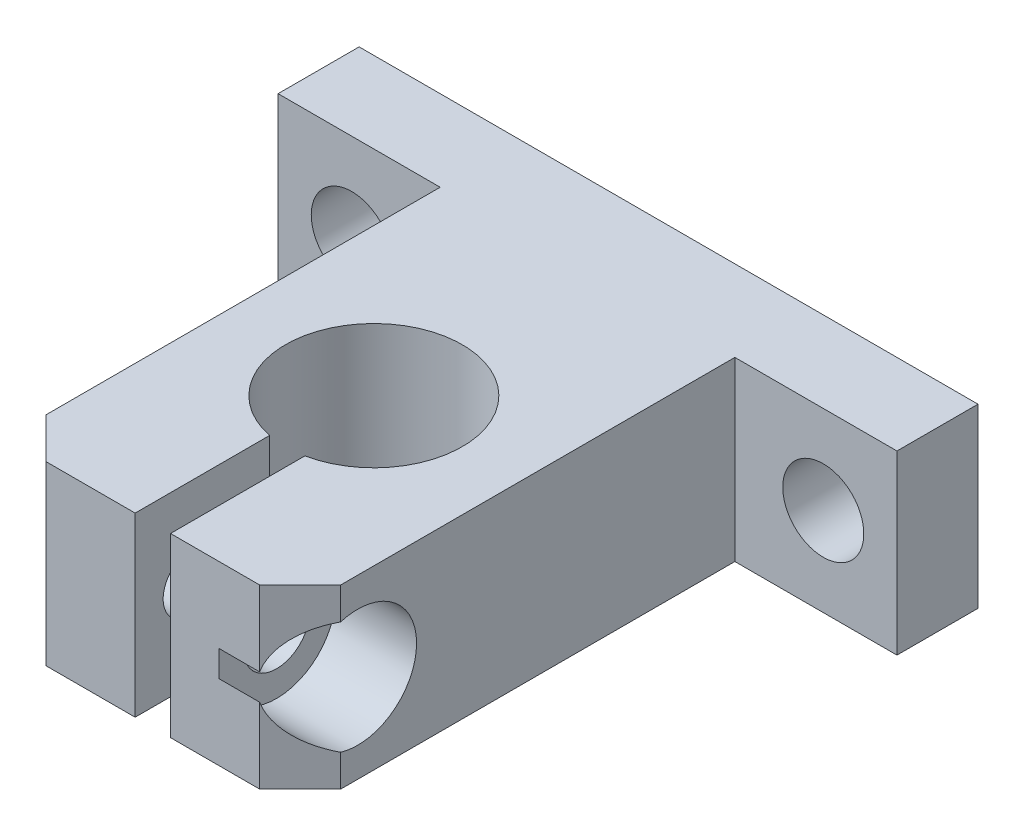
ISO-10303-21;
HEADER;
FILE_DESCRIPTION(('STEP AP214'),'2;1');
FILE_NAME('part.step','',(''),(''),'','','');
FILE_SCHEMA(('AUTOMOTIVE_DESIGN { 1 0 10303 214 1 1 1 1 }'));
ENDSEC;
DATA;
#1=APPLICATION_CONTEXT('core data for automotive mechanical design processes');
#2=APPLICATION_PROTOCOL_DEFINITION('international standard','automotive_design',2000,#1);
#3=PRODUCT_CONTEXT('',#1,'mechanical');
#4=PRODUCT('Part','Part','',(#3));
#5=PRODUCT_RELATED_PRODUCT_CATEGORY('part','',(#4));
#6=PRODUCT_DEFINITION_FORMATION('','',#4);
#7=PRODUCT_DEFINITION_CONTEXT('part definition',#1,'design');
#8=PRODUCT_DEFINITION('design','',#6,#7);
#9=PRODUCT_DEFINITION_SHAPE('','',#8);
#10=(LENGTH_UNIT() NAMED_UNIT(*) SI_UNIT(.MILLI.,.METRE.));
#11=(NAMED_UNIT(*) PLANE_ANGLE_UNIT() SI_UNIT($,.RADIAN.));
#12=(NAMED_UNIT(*) SI_UNIT($,.STERADIAN.) SOLID_ANGLE_UNIT());
#13=UNCERTAINTY_MEASURE_WITH_UNIT(LENGTH_MEASURE(1.E-05),#10,'distance_accuracy_value','');
#14=(GEOMETRIC_REPRESENTATION_CONTEXT(3) GLOBAL_UNCERTAINTY_ASSIGNED_CONTEXT((#13)) GLOBAL_UNIT_ASSIGNED_CONTEXT((#10,
#11,#12)) REPRESENTATION_CONTEXT('',''));
#15=CARTESIAN_POINT('',(0.,0.,0.));
#16=DIRECTION('',(0.,0.,1.));
#17=DIRECTION('',(1.,0.,0.));
#18=AXIS2_PLACEMENT_3D('',#15,#16,#17);
#19=CARTESIAN_POINT('',(8.,0.,11.1));
#20=DIRECTION('',(-1.,0.,0.));
#21=DIRECTION('',(0.,0.,1.));
#22=AXIS2_PLACEMENT_3D('',#19,#20,#21);
#23=CYLINDRICAL_SURFACE('',#22,2.25);
#24=CARTESIAN_POINT('',(4.5,0.,11.1));
#25=DIRECTION('',(-1.,0.,0.));
#26=DIRECTION('',(0.,0.,1.));
#27=AXIS2_PLACEMENT_3D('',#24,#25,#26);
#28=CIRCLE('',#27,2.25);
#29=CARTESIAN_POINT('',(4.5,0.,13.35));
#30=VERTEX_POINT('',#29);
#31=EDGE_CURVE('E18',#30,#30,#28,.F.);
#32=ORIENTED_EDGE('',*,*,#31,.T.);
#33=EDGE_LOOP('',(#32));
#34=FACE_BOUND('',#33,.T.);
#35=CARTESIAN_POINT('',(1.2,0.,11.1));
#36=DIRECTION('',(-1.,0.,0.));
#37=DIRECTION('',(0.,0.,1.));
#38=AXIS2_PLACEMENT_3D('',#35,#36,#37);
#39=CIRCLE('',#38,2.25);
#40=CARTESIAN_POINT('',(1.2,0.,13.35));
#41=VERTEX_POINT('',#40);
#42=EDGE_CURVE('E176',#41,#41,#39,.F.);
#43=ORIENTED_EDGE('',*,*,#42,.F.);
#44=EDGE_LOOP('',(#43));
#45=FACE_BOUND('',#44,.T.);
#46=ADVANCED_FACE('F15',(#34,#45),#23,.F.);
#47=CARTESIAN_POINT('',(-8.,0.,11.1));
#48=DIRECTION('',(1.,0.,0.));
#49=DIRECTION('',(0.,0.,-1.));
#50=AXIS2_PLACEMENT_3D('',#47,#48,#49);
#51=CYLINDRICAL_SURFACE('',#50,2.);
#52=CARTESIAN_POINT('',(-10.,0.,11.1));
#53=DIRECTION('',(1.,0.,0.));
#54=DIRECTION('',(0.,0.,-1.));
#55=AXIS2_PLACEMENT_3D('',#52,#53,#54);
#56=CIRCLE('',#55,2.);
#57=CARTESIAN_POINT('',(-10.,-1.63630681719536,12.25));
#58=VERTEX_POINT('',#57);
#59=CARTESIAN_POINT('',(-10.,1.63630681719536,12.25));
#60=VERTEX_POINT('',#59);
#61=EDGE_CURVE('E303',#58,#60,#56,.T.);
#62=ORIENTED_EDGE('',*,*,#61,.F.);
#63=CARTESIAN_POINT('',(-11.15,0.,11.1));
#64=DIRECTION('',(-0.707106781186548,0.,0.707106781186548));
#65=DIRECTION('',(0.707106781186548,0.,0.707106781186548));
#66=AXIS2_PLACEMENT_3D('',#63,#64,#65);
#67=ELLIPSE('',#66,2.82842712474619,2.);
#68=EDGE_CURVE('E309',#60,#58,#67,.F.);
#69=ORIENTED_EDGE('',*,*,#68,.F.);
#70=EDGE_LOOP('',(#62,#69));
#71=FACE_BOUND('',#70,.T.);
#72=CARTESIAN_POINT('',(-1.2,0.,11.1));
#73=DIRECTION('',(1.,0.,0.));
#74=DIRECTION('',(0.,0.,-1.));
#75=AXIS2_PLACEMENT_3D('',#72,#73,#74);
#76=CIRCLE('',#75,2.);
#77=CARTESIAN_POINT('',(-1.2,0.,9.1));
#78=VERTEX_POINT('',#77);
#79=EDGE_CURVE('E340',#78,#78,#76,.F.);
#80=ORIENTED_EDGE('',*,*,#79,.F.);
#81=EDGE_LOOP('',(#80));
#82=FACE_BOUND('',#81,.T.);
#83=ADVANCED_FACE('F450',(#71,#82),#51,.F.);
#84=CARTESIAN_POINT('',(-16.,0.,-2.5));
#85=DIRECTION('',(0.,0.,-1.));
#86=DIRECTION('',(-1.,0.,0.));
#87=AXIS2_PLACEMENT_3D('',#84,#85,#86);
#88=CYLINDRICAL_SURFACE('',#87,2.75);
#89=CARTESIAN_POINT('',(-16.,0.,-20.));
#90=DIRECTION('',(0.,0.,-1.));
#91=DIRECTION('',(-1.,0.,0.));
#92=AXIS2_PLACEMENT_3D('',#89,#90,#91);
#93=CIRCLE('',#92,2.75);
#94=CARTESIAN_POINT('',(-18.75,0.,-20.));
#95=VERTEX_POINT('',#94);
#96=EDGE_CURVE('E257',#95,#95,#93,.F.);
#97=ORIENTED_EDGE('',*,*,#96,.F.);
#98=EDGE_LOOP('',(#97));
#99=FACE_BOUND('',#98,.T.);
#100=CARTESIAN_POINT('',(-16.,0.,-14.5));
#101=DIRECTION('',(0.,0.,-1.));
#102=DIRECTION('',(-1.,0.,0.));
#103=AXIS2_PLACEMENT_3D('',#100,#101,#102);
#104=CIRCLE('',#103,2.75);
#105=CARTESIAN_POINT('',(-18.75,0.,-14.5));
#106=VERTEX_POINT('',#105);
#107=EDGE_CURVE('E282',#106,#106,#104,.T.);
#108=ORIENTED_EDGE('',*,*,#107,.F.);
#109=EDGE_LOOP('',(#108));
#110=FACE_BOUND('',#109,.T.);
#111=ADVANCED_FACE('F453',(#99,#110),#88,.F.);
#112=CARTESIAN_POINT('',(16.,0.,-2.5));
#113=DIRECTION('',(0.,0.,-1.));
#114=DIRECTION('',(-1.,0.,0.));
#115=AXIS2_PLACEMENT_3D('',#112,#113,#114);
#116=CYLINDRICAL_SURFACE('',#115,2.75);
#117=CARTESIAN_POINT('',(16.,0.,-20.));
#118=DIRECTION('',(0.,0.,-1.));
#119=DIRECTION('',(-1.,0.,0.));
#120=AXIS2_PLACEMENT_3D('',#117,#118,#119);
#121=CIRCLE('',#120,2.75);
#122=CARTESIAN_POINT('',(13.25,0.,-20.));
#123=VERTEX_POINT('',#122);
#124=EDGE_CURVE('E252',#123,#123,#121,.F.);
#125=ORIENTED_EDGE('',*,*,#124,.F.);
#126=EDGE_LOOP('',(#125));
#127=FACE_BOUND('',#126,.T.);
#128=CARTESIAN_POINT('',(16.,0.,-14.5));
#129=DIRECTION('',(0.,0.,-1.));
#130=DIRECTION('',(-1.,0.,0.));
#131=AXIS2_PLACEMENT_3D('',#128,#129,#130);
#132=CIRCLE('',#131,2.75);
#133=CARTESIAN_POINT('',(13.25,0.,-14.5));
#134=VERTEX_POINT('',#133);
#135=EDGE_CURVE('E223',#134,#134,#132,.T.);
#136=ORIENTED_EDGE('',*,*,#135,.F.);
#137=EDGE_LOOP('',(#136));
#138=FACE_BOUND('',#137,.T.);
#139=ADVANCED_FACE('F640',(#127,#138),#116,.F.);
#140=CARTESIAN_POINT('',(4.5,0.,11.1));
#141=DIRECTION('',(-1.,0.,0.));
#142=DIRECTION('',(0.,0.,1.));
#143=AXIS2_PLACEMENT_3D('',#140,#141,#142);
#144=PLANE('',#143);
#145=DIRECTION('',(0.,1.,0.));
#146=VECTOR('',#145,1.);
#147=CARTESIAN_POINT('',(4.5,6.,15.));
#148=LINE('',#147,#146);
#149=CARTESIAN_POINT('',(4.5,-0.888819441731564,15.));
#150=VERTEX_POINT('',#149);
#151=CARTESIAN_POINT('',(4.5,0.888819441731564,15.));
#152=VERTEX_POINT('',#151);
#153=EDGE_CURVE('E148',#150,#152,#148,.T.);
#154=ORIENTED_EDGE('',*,*,#153,.F.);
#155=CARTESIAN_POINT('',(4.5,0.,11.1));
#156=DIRECTION('',(-1.,0.,0.));
#157=DIRECTION('',(0.,0.,1.));
#158=AXIS2_PLACEMENT_3D('',#155,#156,#157);
#159=CIRCLE('',#158,4.);
#160=EDGE_CURVE('E138',#150,#152,#159,.F.);
#161=ORIENTED_EDGE('',*,*,#160,.T.);
#162=EDGE_LOOP('',(#154,#161));
#163=FACE_BOUND('',#162,.T.);
#164=ORIENTED_EDGE('',*,*,#31,.F.);
#165=EDGE_LOOP('',(#164));
#166=FACE_BOUND('',#165,.T.);
#167=ADVANCED_FACE('F149',(#163,#166),#144,.F.);
#168=CARTESIAN_POINT('',(10.,0.,11.1));
#169=DIRECTION('',(-1.,0.,0.));
#170=DIRECTION('',(0.,0.,1.));
#171=AXIS2_PLACEMENT_3D('',#168,#169,#170);
#172=CYLINDRICAL_SURFACE('',#171,4.);
#173=CARTESIAN_POINT('',(10.,0.,11.1));
#174=DIRECTION('',(-1.,0.,0.));
#175=DIRECTION('',(0.,0.,1.));
#176=AXIS2_PLACEMENT_3D('',#173,#174,#175);
#177=CIRCLE('',#176,4.);
#178=CARTESIAN_POINT('',(10.,3.8311225508981,12.25));
#179=VERTEX_POINT('',#178);
#180=CARTESIAN_POINT('',(10.,-3.83112255089811,12.25));
#181=VERTEX_POINT('',#180);
#182=EDGE_CURVE('E208',#179,#181,#177,.T.);
#183=ORIENTED_EDGE('',*,*,#182,.F.);
#184=CARTESIAN_POINT('',(11.15,0.,11.1));
#185=DIRECTION('',(0.707106781186548,0.,0.707106781186548));
#186=DIRECTION('',(-0.707106781186548,0.,0.707106781186548));
#187=AXIS2_PLACEMENT_3D('',#184,#185,#186);
#188=ELLIPSE('',#187,5.65685424949238,4.);
#189=CARTESIAN_POINT('',(7.25,0.888819441731565,15.));
#190=VERTEX_POINT('',#189);
#191=EDGE_CURVE('E147',#190,#179,#188,.F.);
#192=ORIENTED_EDGE('',*,*,#191,.F.);
#193=DIRECTION('',(1.,0.,0.));
#194=VECTOR('',#193,1.);
#195=CARTESIAN_POINT('',(0.,0.888819441731565,15.));
#196=LINE('',#195,#194);
#197=EDGE_CURVE('E145',#152,#190,#196,.T.);
#198=ORIENTED_EDGE('',*,*,#197,.F.);
#199=ORIENTED_EDGE('',*,*,#160,.F.);
#200=DIRECTION('',(1.,0.,0.));
#201=VECTOR('',#200,1.);
#202=CARTESIAN_POINT('',(0.,-0.888819441731565,15.));
#203=LINE('',#202,#201);
#204=CARTESIAN_POINT('',(7.25,-0.888819441731564,15.));
#205=VERTEX_POINT('',#204);
#206=EDGE_CURVE('E143',#205,#150,#203,.F.);
#207=ORIENTED_EDGE('',*,*,#206,.F.);
#208=CARTESIAN_POINT('',(11.15,0.,11.1));
#209=DIRECTION('',(0.707106781186548,0.,0.707106781186548));
#210=DIRECTION('',(-0.707106781186548,0.,0.707106781186548));
#211=AXIS2_PLACEMENT_3D('',#208,#209,#210);
#212=ELLIPSE('',#211,5.65685424949238,4.);
#213=EDGE_CURVE('E157',#181,#205,#212,.F.);
#214=ORIENTED_EDGE('',*,*,#213,.F.);
#215=EDGE_LOOP('',(#183,#192,#198,#199,#207,#214));
#216=FACE_BOUND('',#215,.T.);
#217=ADVANCED_FACE('F141',(#216),#172,.F.);
#218=CARTESIAN_POINT('',(7.25,6.,15.));
#219=DIRECTION('',(0.707106781186548,0.,0.707106781186548));
#220=DIRECTION('',(0.707106781186548,0.,-0.707106781186548));
#221=AXIS2_PLACEMENT_3D('',#218,#219,#220);
#222=PLANE('',#221);
#223=DIRECTION('',(-0.707106781186548,0.,0.707106781186547));
#224=VECTOR('',#223,1.);
#225=CARTESIAN_POINT('',(10.,6.,12.25));
#226=LINE('',#225,#224);
#227=CARTESIAN_POINT('',(10.,6.,12.25));
#228=VERTEX_POINT('',#227);
#229=CARTESIAN_POINT('',(7.25,6.,15.));
#230=VERTEX_POINT('',#229);
#231=EDGE_CURVE('E185',#228,#230,#226,.T.);
#232=ORIENTED_EDGE('',*,*,#231,.T.);
#233=DIRECTION('',(0.,1.,0.));
#234=VECTOR('',#233,1.);
#235=CARTESIAN_POINT('',(7.25,6.,15.));
#236=LINE('',#235,#234);
#237=EDGE_CURVE('E182',#190,#230,#236,.T.);
#238=ORIENTED_EDGE('',*,*,#237,.F.);
#239=ORIENTED_EDGE('',*,*,#191,.T.);
#240=DIRECTION('',(0.,1.,0.));
#241=VECTOR('',#240,1.);
#242=CARTESIAN_POINT('',(10.,0.,12.25));
#243=LINE('',#242,#241);
#244=EDGE_CURVE('E202',#228,#179,#243,.F.);
#245=ORIENTED_EDGE('',*,*,#244,.F.);
#246=EDGE_LOOP('',(#232,#238,#239,#245));
#247=FACE_BOUND('',#246,.T.);
#248=ADVANCED_FACE('F352',(#247),#222,.T.);
#249=CARTESIAN_POINT('',(0.,6.,-5.11236996327425));
#250=DIRECTION('',(0.,-1.,0.));
#251=DIRECTION('',(0.,0.,-1.));
#252=AXIS2_PLACEMENT_3D('',#249,#250,#251);
#253=PLANE('',#252);
#254=DIRECTION('',(1.,0.,0.));
#255=VECTOR('',#254,1.);
#256=CARTESIAN_POINT('',(0.,6.,15.));
#257=LINE('',#256,#255);
#258=CARTESIAN_POINT('',(1.2,6.,15.));
#259=VERTEX_POINT('',#258);
#260=EDGE_CURVE('E179',#230,#259,#257,.F.);
#261=ORIENTED_EDGE('',*,*,#260,.F.);
#262=ORIENTED_EDGE('',*,*,#231,.F.);
#263=DIRECTION('',(0.,0.,-1.));
#264=VECTOR('',#263,1.);
#265=CARTESIAN_POINT('',(10.,6.,3.));
#266=LINE('',#265,#264);
#267=CARTESIAN_POINT('',(10.,6.,-14.5));
#268=VERTEX_POINT('',#267);
#269=EDGE_CURVE('E199',#268,#228,#266,.F.);
#270=ORIENTED_EDGE('',*,*,#269,.F.);
#271=DIRECTION('',(1.,0.,0.));
#272=VECTOR('',#271,1.);
#273=CARTESIAN_POINT('',(20.,6.,-14.5));
#274=LINE('',#273,#272);
#275=CARTESIAN_POINT('',(21.,6.,-14.5));
#276=VERTEX_POINT('',#275);
#277=EDGE_CURVE('E211',#276,#268,#274,.F.);
#278=ORIENTED_EDGE('',*,*,#277,.F.);
#279=DIRECTION('',(0.,0.,-1.));
#280=VECTOR('',#279,1.);
#281=CARTESIAN_POINT('',(21.,6.,1.25));
#282=LINE('',#281,#280);
#283=CARTESIAN_POINT('',(21.,6.,-20.));
#284=VERTEX_POINT('',#283);
#285=EDGE_CURVE('E226',#284,#276,#282,.F.);
#286=ORIENTED_EDGE('',*,*,#285,.F.);
#287=DIRECTION('',(-1.,0.,0.));
#288=VECTOR('',#287,1.);
#289=CARTESIAN_POINT('',(21.,6.,-20.));
#290=LINE('',#289,#288);
#291=CARTESIAN_POINT('',(-21.,6.,-20.));
#292=VERTEX_POINT('',#291);
#293=EDGE_CURVE('E238',#292,#284,#290,.F.);
#294=ORIENTED_EDGE('',*,*,#293,.F.);
#295=DIRECTION('',(0.,0.,1.));
#296=VECTOR('',#295,1.);
#297=CARTESIAN_POINT('',(-21.,6.,-20.));
#298=LINE('',#297,#296);
#299=CARTESIAN_POINT('',(-21.,6.,-14.5));
#300=VERTEX_POINT('',#299);
#301=EDGE_CURVE('E255',#300,#292,#298,.F.);
#302=ORIENTED_EDGE('',*,*,#301,.F.);
#303=DIRECTION('',(1.,0.,0.));
#304=VECTOR('',#303,1.);
#305=CARTESIAN_POINT('',(-20.,6.,-14.5));
#306=LINE('',#305,#304);
#307=CARTESIAN_POINT('',(-10.,6.,-14.5));
#308=VERTEX_POINT('',#307);
#309=EDGE_CURVE('E268',#308,#300,#306,.F.);
#310=ORIENTED_EDGE('',*,*,#309,.F.);
#311=DIRECTION('',(0.,0.,1.));
#312=VECTOR('',#311,1.);
#313=CARTESIAN_POINT('',(-10.,6.,3.));
#314=LINE('',#313,#312);
#315=CARTESIAN_POINT('',(-10.,6.,12.25));
#316=VERTEX_POINT('',#315);
#317=EDGE_CURVE('E285',#316,#308,#314,.F.);
#318=ORIENTED_EDGE('',*,*,#317,.F.);
#319=DIRECTION('',(0.707106781186548,0.,0.707106781186548));
#320=VECTOR('',#319,1.);
#321=CARTESIAN_POINT('',(-21.,6.,1.25));
#322=LINE('',#321,#320);
#323=CARTESIAN_POINT('',(-7.25,6.,15.));
#324=VERTEX_POINT('',#323);
#325=EDGE_CURVE('E301',#324,#316,#322,.F.);
#326=ORIENTED_EDGE('',*,*,#325,.F.);
#327=DIRECTION('',(1.,0.,0.));
#328=VECTOR('',#327,1.);
#329=CARTESIAN_POINT('',(0.,6.,15.));
#330=LINE('',#329,#328);
#331=CARTESIAN_POINT('',(-1.2,6.,15.));
#332=VERTEX_POINT('',#331);
#333=EDGE_CURVE('E312',#332,#324,#330,.F.);
#334=ORIENTED_EDGE('',*,*,#333,.F.);
#335=DIRECTION('',(0.,0.,-1.));
#336=VECTOR('',#335,1.);
#337=CARTESIAN_POINT('',(-1.2,6.,17.5));
#338=LINE('',#337,#336);
#339=CARTESIAN_POINT('',(-1.2,6.,5.87877538267963));
#340=VERTEX_POINT('',#339);
#341=EDGE_CURVE('E317',#340,#332,#338,.F.);
#342=ORIENTED_EDGE('',*,*,#341,.F.);
#343=CARTESIAN_POINT('',(0.,6.,0.));
#344=DIRECTION('',(0.,1.,0.));
#345=DIRECTION('',(0.,0.,1.));
#346=AXIS2_PLACEMENT_3D('',#343,#344,#345);
#347=CIRCLE('',#346,6.);
#348=CARTESIAN_POINT('',(1.2,6.,5.87877538267963));
#349=VERTEX_POINT('',#348);
#350=EDGE_CURVE('E343',#340,#349,#347,.F.);
#351=ORIENTED_EDGE('',*,*,#350,.T.);
#352=DIRECTION('',(0.,0.,1.));
#353=VECTOR('',#352,1.);
#354=CARTESIAN_POINT('',(1.2,6.,17.5));
#355=LINE('',#354,#353);
#356=EDGE_CURVE('E172',#259,#349,#355,.F.);
#357=ORIENTED_EDGE('',*,*,#356,.F.);
#358=EDGE_LOOP('',(#261,#262,#270,#278,#286,#294,#302,#310,#318,#326,#334,#342,#351,#357));
#359=FACE_BOUND('',#358,.T.);
#360=ADVANCED_FACE('F400',(#359),#253,.F.);
#361=CARTESIAN_POINT('',(1.2,0.,17.5));
#362=DIRECTION('',(-1.,0.,0.));
#363=DIRECTION('',(0.,0.,1.));
#364=AXIS2_PLACEMENT_3D('',#361,#362,#363);
#365=PLANE('',#364);
#366=DIRECTION('',(0.,1.,0.));
#367=VECTOR('',#366,1.);
#368=CARTESIAN_POINT('',(1.2,6.,15.));
#369=LINE('',#368,#367);
#370=CARTESIAN_POINT('',(1.2,-6.,15.));
#371=VERTEX_POINT('',#370);
#372=EDGE_CURVE('E164',#259,#371,#369,.F.);
#373=ORIENTED_EDGE('',*,*,#372,.F.);
#374=ORIENTED_EDGE('',*,*,#356,.T.);
#375=DIRECTION('',(0.,1.,0.));
#376=VECTOR('',#375,1.);
#377=CARTESIAN_POINT('',(1.2,0.,5.87877538267963));
#378=LINE('',#377,#376);
#379=CARTESIAN_POINT('',(1.2,-6.,5.87877538267963));
#380=VERTEX_POINT('',#379);
#381=EDGE_CURVE('E175',#349,#380,#378,.F.);
#382=ORIENTED_EDGE('',*,*,#381,.T.);
#383=DIRECTION('',(0.,0.,-1.));
#384=VECTOR('',#383,1.);
#385=CARTESIAN_POINT('',(1.2,-6.,-5.11236996327425));
#386=LINE('',#385,#384);
#387=EDGE_CURVE('E163',#371,#380,#386,.T.);
#388=ORIENTED_EDGE('',*,*,#387,.F.);
#389=EDGE_LOOP('',(#373,#374,#382,#388));
#390=FACE_BOUND('',#389,.T.);
#391=ORIENTED_EDGE('',*,*,#42,.T.);
#392=EDGE_LOOP('',(#391));
#393=FACE_BOUND('',#392,.T.);
#394=ADVANCED_FACE('F403',(#390,#393),#365,.T.);
#395=CARTESIAN_POINT('',(0.,0.,0.));
#396=DIRECTION('',(0.,1.,0.));
#397=DIRECTION('',(0.,0.,1.));
#398=AXIS2_PLACEMENT_3D('',#395,#396,#397);
#399=CYLINDRICAL_SURFACE('',#398,6.);
#400=ORIENTED_EDGE('',*,*,#350,.F.);
#401=DIRECTION('',(0.,1.,0.));
#402=VECTOR('',#401,1.);
#403=CARTESIAN_POINT('',(-1.2,0.,5.87877538267963));
#404=LINE('',#403,#402);
#405=CARTESIAN_POINT('',(-1.2,-6.,5.87877538267963));
#406=VERTEX_POINT('',#405);
#407=EDGE_CURVE('E319',#406,#340,#404,.T.);
#408=ORIENTED_EDGE('',*,*,#407,.F.);
#409=CARTESIAN_POINT('',(0.,-6.,0.));
#410=DIRECTION('',(0.,1.,0.));
#411=DIRECTION('',(0.,0.,1.));
#412=AXIS2_PLACEMENT_3D('',#409,#410,#411);
#413=CIRCLE('',#412,6.);
#414=EDGE_CURVE('E322',#380,#406,#413,.T.);
#415=ORIENTED_EDGE('',*,*,#414,.F.);
#416=ORIENTED_EDGE('',*,*,#381,.F.);
#417=EDGE_LOOP('',(#400,#408,#415,#416));
#418=FACE_BOUND('',#417,.T.);
#419=ADVANCED_FACE('F407',(#418),#399,.F.);
#420=CARTESIAN_POINT('',(-1.2,0.,17.5));
#421=DIRECTION('',(1.,0.,0.));
#422=DIRECTION('',(0.,0.,-1.));
#423=AXIS2_PLACEMENT_3D('',#420,#421,#422);
#424=PLANE('',#423);
#425=DIRECTION('',(0.,1.,0.));
#426=VECTOR('',#425,1.);
#427=CARTESIAN_POINT('',(-1.2,6.,15.));
#428=LINE('',#427,#426);
#429=CARTESIAN_POINT('',(-1.2,-6.,15.));
#430=VERTEX_POINT('',#429);
#431=EDGE_CURVE('E314',#430,#332,#428,.T.);
#432=ORIENTED_EDGE('',*,*,#431,.F.);
#433=DIRECTION('',(0.,0.,-1.));
#434=VECTOR('',#433,1.);
#435=CARTESIAN_POINT('',(-1.2,-6.,-5.11236996327425));
#436=LINE('',#435,#434);
#437=EDGE_CURVE('E324',#406,#430,#436,.F.);
#438=ORIENTED_EDGE('',*,*,#437,.F.);
#439=ORIENTED_EDGE('',*,*,#407,.T.);
#440=ORIENTED_EDGE('',*,*,#341,.T.);
#441=EDGE_LOOP('',(#432,#438,#439,#440));
#442=FACE_BOUND('',#441,.T.);
#443=ORIENTED_EDGE('',*,*,#79,.T.);
#444=EDGE_LOOP('',(#443));
#445=FACE_BOUND('',#444,.T.);
#446=ADVANCED_FACE('F419',(#442,#445),#424,.T.);
#447=CARTESIAN_POINT('',(0.,6.,15.));
#448=DIRECTION('',(0.,0.,1.));
#449=DIRECTION('',(1.,0.,0.));
#450=AXIS2_PLACEMENT_3D('',#447,#448,#449);
#451=PLANE('',#450);
#452=DIRECTION('',(0.,1.,0.));
#453=VECTOR('',#452,1.);
#454=CARTESIAN_POINT('',(-7.25,6.,15.));
#455=LINE('',#454,#453);
#456=CARTESIAN_POINT('',(-7.25,-6.,15.));
#457=VERTEX_POINT('',#456);
#458=EDGE_CURVE('E304',#457,#324,#455,.T.);
#459=ORIENTED_EDGE('',*,*,#458,.F.);
#460=DIRECTION('',(1.,0.,0.));
#461=VECTOR('',#460,1.);
#462=CARTESIAN_POINT('',(0.,-6.,15.));
#463=LINE('',#462,#461);
#464=EDGE_CURVE('E298',#430,#457,#463,.F.);
#465=ORIENTED_EDGE('',*,*,#464,.F.);
#466=ORIENTED_EDGE('',*,*,#431,.T.);
#467=ORIENTED_EDGE('',*,*,#333,.T.);
#468=EDGE_LOOP('',(#459,#465,#466,#467));
#469=FACE_BOUND('',#468,.T.);
#470=ADVANCED_FACE('F423',(#469),#451,.T.);
#471=CARTESIAN_POINT('',(-21.,6.,1.25));
#472=DIRECTION('',(-0.707106781186548,0.,0.707106781186548));
#473=DIRECTION('',(0.707106781186548,0.,0.707106781186548));
#474=AXIS2_PLACEMENT_3D('',#471,#472,#473);
#475=PLANE('',#474);
#476=ORIENTED_EDGE('',*,*,#325,.T.);
#477=DIRECTION('',(0.,1.,0.));
#478=VECTOR('',#477,1.);
#479=CARTESIAN_POINT('',(-10.,0.,12.25));
#480=LINE('',#479,#478);
#481=EDGE_CURVE('E288',#60,#316,#480,.T.);
#482=ORIENTED_EDGE('',*,*,#481,.F.);
#483=ORIENTED_EDGE('',*,*,#68,.T.);
#484=DIRECTION('',(0.,1.,0.));
#485=VECTOR('',#484,1.);
#486=CARTESIAN_POINT('',(-10.,0.,12.25));
#487=LINE('',#486,#485);
#488=CARTESIAN_POINT('',(-10.,-6.,12.25));
#489=VERTEX_POINT('',#488);
#490=EDGE_CURVE('E287',#489,#58,#487,.T.);
#491=ORIENTED_EDGE('',*,*,#490,.F.);
#492=DIRECTION('',(-0.707106781186548,0.,-0.707106781186547));
#493=VECTOR('',#492,1.);
#494=CARTESIAN_POINT('',(-7.25,-6.,15.));
#495=LINE('',#494,#493);
#496=EDGE_CURVE('E293',#457,#489,#495,.T.);
#497=ORIENTED_EDGE('',*,*,#496,.F.);
#498=ORIENTED_EDGE('',*,*,#458,.T.);
#499=EDGE_LOOP('',(#476,#482,#483,#491,#497,#498));
#500=FACE_BOUND('',#499,.T.);
#501=ADVANCED_FACE('F427',(#500),#475,.T.);
#502=CARTESIAN_POINT('',(-10.,0.,3.));
#503=DIRECTION('',(-1.,0.,0.));
#504=DIRECTION('',(0.,0.,1.));
#505=AXIS2_PLACEMENT_3D('',#502,#503,#504);
#506=PLANE('',#505);
#507=DIRECTION('',(0.,0.,-1.));
#508=VECTOR('',#507,1.);
#509=CARTESIAN_POINT('',(-10.,-6.,-5.11236996327425));
#510=LINE('',#509,#508);
#511=CARTESIAN_POINT('',(-10.,-6.,-14.5));
#512=VERTEX_POINT('',#511);
#513=EDGE_CURVE('E277',#489,#512,#510,.T.);
#514=ORIENTED_EDGE('',*,*,#513,.F.);
#515=ORIENTED_EDGE('',*,*,#490,.T.);
#516=ORIENTED_EDGE('',*,*,#61,.T.);
#517=ORIENTED_EDGE('',*,*,#481,.T.);
#518=ORIENTED_EDGE('',*,*,#317,.T.);
#519=DIRECTION('',(0.,1.,0.));
#520=VECTOR('',#519,1.);
#521=CARTESIAN_POINT('',(-10.,0.,-14.5));
#522=LINE('',#521,#520);
#523=EDGE_CURVE('E272',#512,#308,#522,.T.);
#524=ORIENTED_EDGE('',*,*,#523,.F.);
#525=EDGE_LOOP('',(#514,#515,#516,#517,#518,#524));
#526=FACE_BOUND('',#525,.T.);
#527=ADVANCED_FACE('F431',(#526),#506,.T.);
#528=CARTESIAN_POINT('',(-20.,0.,-14.5));
#529=DIRECTION('',(0.,0.,1.));
#530=DIRECTION('',(1.,0.,0.));
#531=AXIS2_PLACEMENT_3D('',#528,#529,#530);
#532=PLANE('',#531);
#533=ORIENTED_EDGE('',*,*,#523,.T.);
#534=ORIENTED_EDGE('',*,*,#309,.T.);
#535=DIRECTION('',(0.,1.,0.));
#536=VECTOR('',#535,1.);
#537=CARTESIAN_POINT('',(-21.,6.,-14.5));
#538=LINE('',#537,#536);
#539=CARTESIAN_POINT('',(-21.,-6.,-14.5));
#540=VERTEX_POINT('',#539);
#541=EDGE_CURVE('E258',#540,#300,#538,.T.);
#542=ORIENTED_EDGE('',*,*,#541,.F.);
#543=DIRECTION('',(1.,0.,0.));
#544=VECTOR('',#543,1.);
#545=CARTESIAN_POINT('',(0.,-6.,-14.5));
#546=LINE('',#545,#544);
#547=EDGE_CURVE('E263',#512,#540,#546,.F.);
#548=ORIENTED_EDGE('',*,*,#547,.F.);
#549=EDGE_LOOP('',(#533,#534,#542,#548));
#550=FACE_BOUND('',#549,.T.);
#551=ORIENTED_EDGE('',*,*,#107,.T.);
#552=EDGE_LOOP('',(#551));
#553=FACE_BOUND('',#552,.T.);
#554=ADVANCED_FACE('F435',(#550,#553),#532,.T.);
#555=CARTESIAN_POINT('',(-21.,6.,-20.));
#556=DIRECTION('',(-1.,0.,0.));
#557=DIRECTION('',(0.,0.,1.));
#558=AXIS2_PLACEMENT_3D('',#555,#556,#557);
#559=PLANE('',#558);
#560=DIRECTION('',(0.,1.,0.));
#561=VECTOR('',#560,1.);
#562=CARTESIAN_POINT('',(-21.,6.,-20.));
#563=LINE('',#562,#561);
#564=CARTESIAN_POINT('',(-21.,-6.,-20.));
#565=VERTEX_POINT('',#564);
#566=EDGE_CURVE('E242',#565,#292,#563,.T.);
#567=ORIENTED_EDGE('',*,*,#566,.F.);
#568=DIRECTION('',(0.,0.,-1.));
#569=VECTOR('',#568,1.);
#570=CARTESIAN_POINT('',(-21.,-6.,-5.11236996327425));
#571=LINE('',#570,#569);
#572=EDGE_CURVE('E247',#540,#565,#571,.T.);
#573=ORIENTED_EDGE('',*,*,#572,.F.);
#574=ORIENTED_EDGE('',*,*,#541,.T.);
#575=ORIENTED_EDGE('',*,*,#301,.T.);
#576=EDGE_LOOP('',(#567,#573,#574,#575));
#577=FACE_BOUND('',#576,.T.);
#578=ADVANCED_FACE('F440',(#577),#559,.T.);
#579=CARTESIAN_POINT('',(21.,6.,-20.));
#580=DIRECTION('',(0.,0.,-1.));
#581=DIRECTION('',(-1.,0.,0.));
#582=AXIS2_PLACEMENT_3D('',#579,#580,#581);
#583=PLANE('',#582);
#584=ORIENTED_EDGE('',*,*,#293,.T.);
#585=DIRECTION('',(0.,1.,0.));
#586=VECTOR('',#585,1.);
#587=CARTESIAN_POINT('',(21.,6.,-20.));
#588=LINE('',#587,#586);
#589=CARTESIAN_POINT('',(21.,-6.,-20.));
#590=VERTEX_POINT('',#589);
#591=EDGE_CURVE('E228',#590,#284,#588,.T.);
#592=ORIENTED_EDGE('',*,*,#591,.F.);
#593=DIRECTION('',(1.,0.,0.));
#594=VECTOR('',#593,1.);
#595=CARTESIAN_POINT('',(0.,-6.,-20.));
#596=LINE('',#595,#594);
#597=EDGE_CURVE('E233',#565,#590,#596,.T.);
#598=ORIENTED_EDGE('',*,*,#597,.F.);
#599=ORIENTED_EDGE('',*,*,#566,.T.);
#600=EDGE_LOOP('',(#584,#592,#598,#599));
#601=FACE_BOUND('',#600,.T.);
#602=ORIENTED_EDGE('',*,*,#124,.T.);
#603=EDGE_LOOP('',(#602));
#604=FACE_BOUND('',#603,.T.);
#605=ORIENTED_EDGE('',*,*,#96,.T.);
#606=EDGE_LOOP('',(#605));
#607=FACE_BOUND('',#606,.T.);
#608=ADVANCED_FACE('F443',(#601,#604,#607),#583,.T.);
#609=CARTESIAN_POINT('',(21.,6.,1.25));
#610=DIRECTION('',(1.,0.,0.));
#611=DIRECTION('',(0.,0.,-1.));
#612=AXIS2_PLACEMENT_3D('',#609,#610,#611);
#613=PLANE('',#612);
#614=ORIENTED_EDGE('',*,*,#591,.T.);
#615=ORIENTED_EDGE('',*,*,#285,.T.);
#616=DIRECTION('',(0.,1.,0.));
#617=VECTOR('',#616,1.);
#618=CARTESIAN_POINT('',(21.,0.,-14.5));
#619=LINE('',#618,#617);
#620=CARTESIAN_POINT('',(21.,-6.,-14.5));
#621=VERTEX_POINT('',#620);
#622=EDGE_CURVE('E213',#621,#276,#619,.T.);
#623=ORIENTED_EDGE('',*,*,#622,.F.);
#624=DIRECTION('',(0.,0.,-1.));
#625=VECTOR('',#624,1.);
#626=CARTESIAN_POINT('',(21.,-6.,-5.11236996327425));
#627=LINE('',#626,#625);
#628=EDGE_CURVE('E218',#590,#621,#627,.F.);
#629=ORIENTED_EDGE('',*,*,#628,.F.);
#630=EDGE_LOOP('',(#614,#615,#623,#629));
#631=FACE_BOUND('',#630,.T.);
#632=ADVANCED_FACE('F447',(#631),#613,.T.);
#633=CARTESIAN_POINT('',(20.,0.,-14.5));
#634=DIRECTION('',(0.,0.,1.));
#635=DIRECTION('',(1.,0.,0.));
#636=AXIS2_PLACEMENT_3D('',#633,#634,#635);
#637=PLANE('',#636);
#638=DIRECTION('',(0.,1.,0.));
#639=VECTOR('',#638,1.);
#640=CARTESIAN_POINT('',(10.,0.,-14.5));
#641=LINE('',#640,#639);
#642=CARTESIAN_POINT('',(10.,-6.,-14.5));
#643=VERTEX_POINT('',#642);
#644=EDGE_CURVE('E203',#643,#268,#641,.T.);
#645=ORIENTED_EDGE('',*,*,#644,.F.);
#646=DIRECTION('',(1.,0.,0.));
#647=VECTOR('',#646,1.);
#648=CARTESIAN_POINT('',(0.,-6.,-14.5));
#649=LINE('',#648,#647);
#650=EDGE_CURVE('E196',#621,#643,#649,.F.);
#651=ORIENTED_EDGE('',*,*,#650,.F.);
#652=ORIENTED_EDGE('',*,*,#622,.T.);
#653=ORIENTED_EDGE('',*,*,#277,.T.);
#654=EDGE_LOOP('',(#645,#651,#652,#653));
#655=FACE_BOUND('',#654,.T.);
#656=ORIENTED_EDGE('',*,*,#135,.T.);
#657=EDGE_LOOP('',(#656));
#658=FACE_BOUND('',#657,.T.);
#659=ADVANCED_FACE('F395',(#655,#658),#637,.T.);
#660=CARTESIAN_POINT('',(10.,0.,3.));
#661=DIRECTION('',(1.,0.,0.));
#662=DIRECTION('',(0.,0.,-1.));
#663=AXIS2_PLACEMENT_3D('',#660,#661,#662);
#664=PLANE('',#663);
#665=ORIENTED_EDGE('',*,*,#269,.T.);
#666=ORIENTED_EDGE('',*,*,#244,.T.);
#667=ORIENTED_EDGE('',*,*,#182,.T.);
#668=DIRECTION('',(0.,1.,0.));
#669=VECTOR('',#668,1.);
#670=CARTESIAN_POINT('',(10.,6.,12.25));
#671=LINE('',#670,#669);
#672=CARTESIAN_POINT('',(10.,-6.00000000000001,12.25));
#673=VERTEX_POINT('',#672);
#674=EDGE_CURVE('E154',#673,#181,#671,.T.);
#675=ORIENTED_EDGE('',*,*,#674,.F.);
#676=DIRECTION('',(0.,0.,-1.));
#677=VECTOR('',#676,1.);
#678=CARTESIAN_POINT('',(10.,-6.,-5.11236996327425));
#679=LINE('',#678,#677);
#680=EDGE_CURVE('E169',#643,#673,#679,.F.);
#681=ORIENTED_EDGE('',*,*,#680,.F.);
#682=ORIENTED_EDGE('',*,*,#644,.T.);
#683=EDGE_LOOP('',(#665,#666,#667,#675,#681,#682));
#684=FACE_BOUND('',#683,.T.);
#685=ADVANCED_FACE('F354',(#684),#664,.T.);
#686=CARTESIAN_POINT('',(7.25,6.,15.));
#687=DIRECTION('',(0.707106781186548,0.,0.707106781186548));
#688=DIRECTION('',(0.707106781186548,0.,-0.707106781186548));
#689=AXIS2_PLACEMENT_3D('',#686,#687,#688);
#690=PLANE('',#689);
#691=DIRECTION('',(-0.707106781186548,0.,0.707106781186547));
#692=VECTOR('',#691,1.);
#693=CARTESIAN_POINT('',(10.,-6.,12.25));
#694=LINE('',#693,#692);
#695=CARTESIAN_POINT('',(7.25,-6.,15.));
#696=VERTEX_POINT('',#695);
#697=EDGE_CURVE('E24',#673,#696,#694,.T.);
#698=ORIENTED_EDGE('',*,*,#697,.F.);
#699=ORIENTED_EDGE('',*,*,#674,.T.);
#700=ORIENTED_EDGE('',*,*,#213,.T.);
#701=DIRECTION('',(0.,1.,0.));
#702=VECTOR('',#701,1.);
#703=CARTESIAN_POINT('',(7.25,6.,15.));
#704=LINE('',#703,#702);
#705=EDGE_CURVE('E33',#696,#205,#704,.T.);
#706=ORIENTED_EDGE('',*,*,#705,.F.);
#707=EDGE_LOOP('',(#698,#699,#700,#706));
#708=FACE_BOUND('',#707,.T.);
#709=ADVANCED_FACE('F391',(#708),#690,.T.);
#710=CARTESIAN_POINT('',(0.,6.,15.));
#711=DIRECTION('',(0.,0.,1.));
#712=DIRECTION('',(1.,0.,0.));
#713=AXIS2_PLACEMENT_3D('',#710,#711,#712);
#714=PLANE('',#713);
#715=DIRECTION('',(1.,0.,0.));
#716=VECTOR('',#715,1.);
#717=CARTESIAN_POINT('',(0.,-6.,15.));
#718=LINE('',#717,#716);
#719=EDGE_CURVE('E10',#696,#371,#718,.F.);
#720=ORIENTED_EDGE('',*,*,#719,.F.);
#721=ORIENTED_EDGE('',*,*,#705,.T.);
#722=ORIENTED_EDGE('',*,*,#206,.T.);
#723=ORIENTED_EDGE('',*,*,#153,.T.);
#724=ORIENTED_EDGE('',*,*,#197,.T.);
#725=ORIENTED_EDGE('',*,*,#237,.T.);
#726=ORIENTED_EDGE('',*,*,#260,.T.);
#727=ORIENTED_EDGE('',*,*,#372,.T.);
#728=EDGE_LOOP('',(#720,#721,#722,#723,#724,#725,#726,#727));
#729=FACE_BOUND('',#728,.T.);
#730=ADVANCED_FACE('F153',(#729),#714,.T.);
#731=CARTESIAN_POINT('',(0.,-6.,-5.11236996327425));
#732=DIRECTION('',(0.,-1.,0.));
#733=DIRECTION('',(0.,0.,-1.));
#734=AXIS2_PLACEMENT_3D('',#731,#732,#733);
#735=PLANE('',#734);
#736=ORIENTED_EDGE('',*,*,#697,.T.);
#737=ORIENTED_EDGE('',*,*,#719,.T.);
#738=ORIENTED_EDGE('',*,*,#387,.T.);
#739=ORIENTED_EDGE('',*,*,#414,.T.);
#740=ORIENTED_EDGE('',*,*,#437,.T.);
#741=ORIENTED_EDGE('',*,*,#464,.T.);
#742=ORIENTED_EDGE('',*,*,#496,.T.);
#743=ORIENTED_EDGE('',*,*,#513,.T.);
#744=ORIENTED_EDGE('',*,*,#547,.T.);
#745=ORIENTED_EDGE('',*,*,#572,.T.);
#746=ORIENTED_EDGE('',*,*,#597,.T.);
#747=ORIENTED_EDGE('',*,*,#628,.T.);
#748=ORIENTED_EDGE('',*,*,#650,.T.);
#749=ORIENTED_EDGE('',*,*,#680,.T.);
#750=EDGE_LOOP('',(#736,#737,#738,#739,#740,#741,#742,#743,#744,#745,#746,#747,#748,#749));
#751=FACE_BOUND('',#750,.T.);
#752=ADVANCED_FACE('F389',(#751),#735,.T.);
#753=CLOSED_SHELL('',(#46,#83,#111,#139,#167,#217,#248,#360,#394,#419,#446,#470,#501,#527,#554,
#578,#608,#632,#659,#685,#709,#730,#752));
#754=MANIFOLD_SOLID_BREP('B1',#753);
#755=ADVANCED_BREP_SHAPE_REPRESENTATION('',(#18,#754),#14);
#756=SHAPE_DEFINITION_REPRESENTATION(#9,#755);
ENDSEC;
END-ISO-10303-21;
